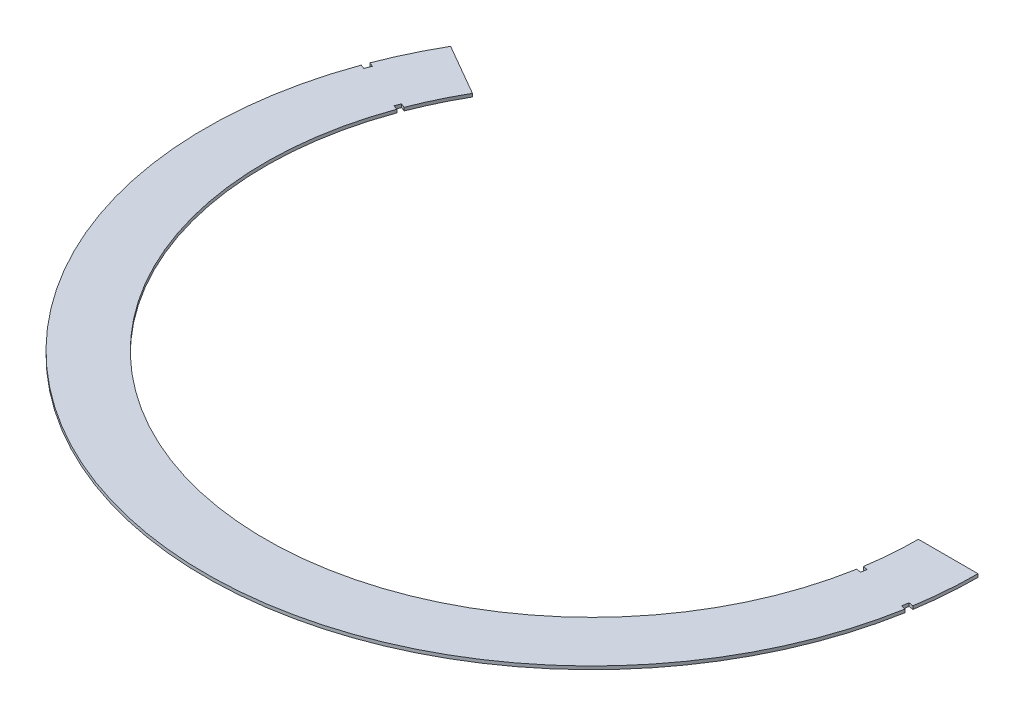
ISO-10303-21;
HEADER;
FILE_DESCRIPTION(('STEP AP214'),'2;1');
FILE_NAME('part.step','',(''),(''),'','','');
FILE_SCHEMA(('AUTOMOTIVE_DESIGN { 1 0 10303 214 1 1 1 1 }'));
ENDSEC;
DATA;
#1=APPLICATION_CONTEXT('core data for automotive mechanical design processes');
#2=APPLICATION_PROTOCOL_DEFINITION('international standard','automotive_design',2000,#1);
#3=PRODUCT_CONTEXT('',#1,'mechanical');
#4=PRODUCT('Part','Part','',(#3));
#5=PRODUCT_RELATED_PRODUCT_CATEGORY('part','',(#4));
#6=PRODUCT_DEFINITION_FORMATION('','',#4);
#7=PRODUCT_DEFINITION_CONTEXT('part definition',#1,'design');
#8=PRODUCT_DEFINITION('design','',#6,#7);
#9=PRODUCT_DEFINITION_SHAPE('','',#8);
#10=(LENGTH_UNIT() NAMED_UNIT(*) SI_UNIT(.MILLI.,.METRE.));
#11=(NAMED_UNIT(*) PLANE_ANGLE_UNIT() SI_UNIT($,.RADIAN.));
#12=(NAMED_UNIT(*) SI_UNIT($,.STERADIAN.) SOLID_ANGLE_UNIT());
#13=UNCERTAINTY_MEASURE_WITH_UNIT(LENGTH_MEASURE(1.E-05),#10,'distance_accuracy_value','');
#14=(GEOMETRIC_REPRESENTATION_CONTEXT(3) GLOBAL_UNCERTAINTY_ASSIGNED_CONTEXT((#13)) GLOBAL_UNIT_ASSIGNED_CONTEXT((#10,
#11,#12)) REPRESENTATION_CONTEXT('',''));
#15=CARTESIAN_POINT('',(0.,0.,0.));
#16=DIRECTION('',(0.,0.,1.));
#17=DIRECTION('',(1.,0.,0.));
#18=AXIS2_PLACEMENT_3D('',#15,#16,#17);
#19=CARTESIAN_POINT('',(0.,0.,0.));
#20=DIRECTION('',(0.,1.,0.));
#21=DIRECTION('',(0.,0.,1.));
#22=AXIS2_PLACEMENT_3D('',#19,#20,#21);
#23=PLANE('',#22);
#24=DIRECTION('',(0.98480775301221,0.,0.173648177666918));
#25=VECTOR('',#24,1.);
#26=CARTESIAN_POINT('',(0.,0.,0.));
#27=LINE('',#26,#25);
#28=CARTESIAN_POINT('',(81.9681853573279,0.,14.4532026382084));
#29=VERTEX_POINT('',#28);
#30=CARTESIAN_POINT('',(82.9405089586884,0.,14.6246495231078));
#31=VERTEX_POINT('',#30);
#32=EDGE_CURVE('E204',#29,#31,#27,.T.);
#33=ORIENTED_EDGE('',*,*,#32,.T.);
#34=CARTESIAN_POINT('',(0.,0.,0.));
#35=DIRECTION('',(0.,1.,0.));
#36=DIRECTION('',(0.,0.,1.));
#37=AXIS2_PLACEMENT_3D('',#34,#35,#36);
#38=CIRCLE('',#37,84.22);
#39=CARTESIAN_POINT('',(-79.140912522589,0.,-28.8049364708883));
#40=VERTEX_POINT('',#39);
#41=EDGE_CURVE('E374',#40,#31,#38,.T.);
#42=ORIENTED_EDGE('',*,*,#41,.F.);
#43=DIRECTION('',(-0.939692620785906,0.,-0.342020143325675));
#44=VECTOR('',#43,1.);
#45=CARTESIAN_POINT('',(0.,0.,0.));
#46=LINE('',#45,#44);
#47=CARTESIAN_POINT('',(-78.213132140662,0.,-28.4672520279307));
#48=VERTEX_POINT('',#47);
#49=EDGE_CURVE('E397',#48,#40,#46,.T.);
#50=ORIENTED_EDGE('',*,*,#49,.F.);
#51=DIRECTION('',(-0.358367949545303,0.,0.933580426497201));
#52=VECTOR('',#51,1.);
#53=CARTESIAN_POINT('',(-77.6925630930972,0.,-29.8233807611599));
#54=LINE('',#53,#52);
#55=CARTESIAN_POINT('',(-77.6925630930972,0.,-29.8233807611599));
#56=VERTEX_POINT('',#55);
#57=EDGE_CURVE('E598',#56,#48,#54,.T.);
#58=ORIENTED_EDGE('',*,*,#57,.F.);
#59=DIRECTION('',(-0.933580426497202,0.,-0.3583679495453));
#60=VECTOR('',#59,1.);
#61=CARTESIAN_POINT('',(-66.4895979751307,0.,-25.5229653666163));
#62=LINE('',#61,#60);
#63=CARTESIAN_POINT('',(-78.6261435195944,0.,-30.1817487107052));
#64=VERTEX_POINT('',#63);
#65=EDGE_CURVE('E266',#56,#64,#62,.T.);
#66=ORIENTED_EDGE('',*,*,#65,.T.);
#67=CARTESIAN_POINT('',(0.,0.,0.));
#68=DIRECTION('',(0.,1.,0.));
#69=DIRECTION('',(0.,0.,1.));
#70=AXIS2_PLACEMENT_3D('',#67,#68,#69);
#71=CIRCLE('',#70,84.22);
#72=CARTESIAN_POINT('',(-72.9366595067257,0.,-42.1099999999996));
#73=VERTEX_POINT('',#72);
#74=EDGE_CURVE('E262',#73,#64,#71,.T.);
#75=ORIENTED_EDGE('',*,*,#74,.F.);
#76=DIRECTION('',(-0.866025403784442,0.,-0.499999999999995));
#77=VECTOR('',#76,1.);
#78=CARTESIAN_POINT('',(-61.6783292575279,0.,-35.6099999999996));
#79=LINE('',#78,#77);
#80=CARTESIAN_POINT('',(-61.6783292575279,0.,-35.6099999999996));
#81=VERTEX_POINT('',#80);
#82=EDGE_CURVE('E281',#81,#73,#79,.T.);
#83=ORIENTED_EDGE('',*,*,#82,.F.);
#84=CARTESIAN_POINT('',(0.,0.,0.));
#85=DIRECTION('',(0.,-1.,0.));
#86=DIRECTION('',(0.,0.,-1.));
#87=AXIS2_PLACEMENT_3D('',#84,#85,#86);
#88=CIRCLE('',#87,71.22);
#89=CARTESIAN_POINT('',(-66.4895979751307,0.,-25.5229653666163));
#90=VERTEX_POINT('',#89);
#91=EDGE_CURVE('E257',#90,#81,#88,.T.);
#92=ORIENTED_EDGE('',*,*,#91,.F.);
#93=CARTESIAN_POINT('',(-67.4231784016279,0.,-25.8813333161616));
#94=VERTEX_POINT('',#93);
#95=EDGE_CURVE('E269',#90,#94,#62,.T.);
#96=ORIENTED_EDGE('',*,*,#95,.T.);
#97=DIRECTION('',(0.358367949545302,0.,-0.933580426497201));
#98=VECTOR('',#97,1.);
#99=CARTESIAN_POINT('',(-67.4231784016279,0.,-25.8813333161616));
#100=LINE('',#99,#98);
#101=CARTESIAN_POINT('',(-67.8749387550902,0.,-24.7044573594948));
#102=VERTEX_POINT('',#101);
#103=EDGE_CURVE('E591',#102,#94,#100,.T.);
#104=ORIENTED_EDGE('',*,*,#103,.F.);
#105=CARTESIAN_POINT('',(-66.9249084523723,0.,-24.3586746076545));
#106=VERTEX_POINT('',#105);
#107=EDGE_CURVE('E43',#106,#102,#46,.T.);
#108=ORIENTED_EDGE('',*,*,#107,.F.);
#109=CARTESIAN_POINT('',(0.,0.,0.));
#110=DIRECTION('',(0.,-1.,0.));
#111=DIRECTION('',(0.,0.,-1.));
#112=AXIS2_PLACEMENT_3D('',#109,#110,#111);
#113=CIRCLE('',#112,71.22);
#114=CARTESIAN_POINT('',(70.1380081695296,0.,12.3672232134379));
#115=VERTEX_POINT('',#114);
#116=EDGE_CURVE('E37',#115,#106,#113,.T.);
#117=ORIENTED_EDGE('',*,*,#116,.F.);
#118=DIRECTION('',(0.98480775301221,0.,0.173648177666918));
#119=VECTOR('',#118,1.);
#120=CARTESIAN_POINT('',(0.,0.,0.));
#121=LINE('',#120,#119);
#122=CARTESIAN_POINT('',(71.1336499219685,0.,12.5427817175127));
#123=VERTEX_POINT('',#122);
#124=EDGE_CURVE('E234',#115,#123,#121,.T.);
#125=ORIENTED_EDGE('',*,*,#124,.T.);
#126=DIRECTION('',(0.156434465040222,0.,-0.987688340595139));
#127=VECTOR('',#126,1.);
#128=CARTESIAN_POINT('',(71.3308519577809,0.,11.297697065205));
#129=LINE('',#128,#127);
#130=CARTESIAN_POINT('',(71.3308519577809,0.,11.297697065205));
#131=VERTEX_POINT('',#130);
#132=EDGE_CURVE('E214',#123,#131,#129,.T.);
#133=ORIENTED_EDGE('',*,*,#132,.T.);
#134=DIRECTION('',(0.987688340595139,0.,0.156434465040225));
#135=VECTOR('',#134,1.);
#136=CARTESIAN_POINT('',(70.3431636171858,0.,11.1412626001648));
#137=LINE('',#136,#135);
#138=CARTESIAN_POINT('',(70.3431636171858,0.,11.1412626001648));
#139=VERTEX_POINT('',#138);
#140=EDGE_CURVE('E224',#139,#131,#137,.T.);
#141=ORIENTED_EDGE('',*,*,#140,.F.);
#142=CARTESIAN_POINT('',(71.22,0.,0.));
#143=VERTEX_POINT('',#142);
#144=EDGE_CURVE('E378',#143,#139,#113,.T.);
#145=ORIENTED_EDGE('',*,*,#144,.F.);
#146=DIRECTION('',(-1.,0.,0.));
#147=VECTOR('',#146,1.);
#148=CARTESIAN_POINT('',(71.22,0.,0.));
#149=LINE('',#148,#147);
#150=CARTESIAN_POINT('',(84.22,0.,0.));
#151=VERTEX_POINT('',#150);
#152=EDGE_CURVE('E365',#151,#143,#149,.T.);
#153=ORIENTED_EDGE('',*,*,#152,.F.);
#154=CARTESIAN_POINT('',(83.1831120449226,0.,13.1749106456877));
#155=VERTEX_POINT('',#154);
#156=EDGE_CURVE('E413',#155,#151,#38,.T.);
#157=ORIENTED_EDGE('',*,*,#156,.F.);
#158=DIRECTION('',(0.987688340595139,0.,0.156434465040225));
#159=VECTOR('',#158,1.);
#160=CARTESIAN_POINT('',(70.3431636171858,0.,11.1412626001648));
#161=LINE('',#160,#159);
#162=CARTESIAN_POINT('',(82.1954237043275,0.,13.0184761806475));
#163=VERTEX_POINT('',#162);
#164=EDGE_CURVE('E51',#163,#155,#161,.T.);
#165=ORIENTED_EDGE('',*,*,#164,.F.);
#166=DIRECTION('',(-0.156434465040222,0.,0.987688340595139));
#167=VECTOR('',#166,1.);
#168=CARTESIAN_POINT('',(82.1954237043275,0.,13.0184761806475));
#169=LINE('',#168,#167);
#170=EDGE_CURVE('E180',#163,#29,#169,.T.);
#171=ORIENTED_EDGE('',*,*,#170,.T.);
#172=EDGE_LOOP('',(#33,#42,#50,#58,#66,#75,#83,#92,#96,#104,#108,#117,#125,#133,#141,#145,#153,
#157,#165,#171));
#173=FACE_BOUND('',#172,.T.);
#174=ADVANCED_FACE('F33',(#173),#23,.F.);
#175=CARTESIAN_POINT('',(0.,0.7,0.));
#176=DIRECTION('',(0.,1.,0.));
#177=DIRECTION('',(0.,0.,1.));
#178=AXIS2_PLACEMENT_3D('',#175,#176,#177);
#179=PLANE('',#178);
#180=CARTESIAN_POINT('',(0.,0.7,0.));
#181=DIRECTION('',(0.,1.,0.));
#182=DIRECTION('',(0.,0.,1.));
#183=AXIS2_PLACEMENT_3D('',#180,#181,#182);
#184=CIRCLE('',#183,84.22);
#185=CARTESIAN_POINT('',(-79.140912522589,0.7,-28.8049364708883));
#186=VERTEX_POINT('',#185);
#187=CARTESIAN_POINT('',(82.9405089586884,0.7,14.6246495231078));
#188=VERTEX_POINT('',#187);
#189=EDGE_CURVE('E385',#186,#188,#184,.T.);
#190=ORIENTED_EDGE('',*,*,#189,.T.);
#191=DIRECTION('',(-0.98480775301221,0.,-0.173648177666918));
#192=VECTOR('',#191,1.);
#193=CARTESIAN_POINT('',(84.9101244647128,0.7,14.9719458784417));
#194=LINE('',#193,#192);
#195=CARTESIAN_POINT('',(81.9681853573279,0.7,14.4532026382084));
#196=VERTEX_POINT('',#195);
#197=EDGE_CURVE('E192',#188,#196,#194,.T.);
#198=ORIENTED_EDGE('',*,*,#197,.T.);
#199=DIRECTION('',(-0.156434465040222,0.,0.987688340595139));
#200=VECTOR('',#199,1.);
#201=CARTESIAN_POINT('',(82.1954237043275,0.699999999999999,13.0184761806475));
#202=LINE('',#201,#200);
#203=CARTESIAN_POINT('',(82.1954237043275,0.699999999999999,13.0184761806475));
#204=VERTEX_POINT('',#203);
#205=EDGE_CURVE('E177',#204,#196,#202,.T.);
#206=ORIENTED_EDGE('',*,*,#205,.F.);
#207=DIRECTION('',(0.987688340595139,0.,0.156434465040225));
#208=VECTOR('',#207,1.);
#209=CARTESIAN_POINT('',(70.3431636171858,0.7,11.1412626001648));
#210=LINE('',#209,#208);
#211=CARTESIAN_POINT('',(83.1831120449226,0.7,13.1749106456877));
#212=VERTEX_POINT('',#211);
#213=EDGE_CURVE('E183',#204,#212,#210,.T.);
#214=ORIENTED_EDGE('',*,*,#213,.T.);
#215=CARTESIAN_POINT('',(84.22,0.7,0.));
#216=VERTEX_POINT('',#215);
#217=EDGE_CURVE('E383',#212,#216,#184,.T.);
#218=ORIENTED_EDGE('',*,*,#217,.T.);
#219=DIRECTION('',(-1.,0.,0.));
#220=VECTOR('',#219,1.);
#221=CARTESIAN_POINT('',(71.22,0.7,0.));
#222=LINE('',#221,#220);
#223=CARTESIAN_POINT('',(71.22,0.7,0.));
#224=VERTEX_POINT('',#223);
#225=EDGE_CURVE('E408',#216,#224,#222,.T.);
#226=ORIENTED_EDGE('',*,*,#225,.T.);
#227=CARTESIAN_POINT('',(0.,0.7,0.));
#228=DIRECTION('',(0.,-1.,0.));
#229=DIRECTION('',(0.,0.,-1.));
#230=AXIS2_PLACEMENT_3D('',#227,#228,#229);
#231=CIRCLE('',#230,71.22);
#232=CARTESIAN_POINT('',(70.3431636171858,0.7,11.1412626001648));
#233=VERTEX_POINT('',#232);
#234=EDGE_CURVE('E380',#224,#233,#231,.T.);
#235=ORIENTED_EDGE('',*,*,#234,.T.);
#236=DIRECTION('',(0.987688340595139,0.,0.156434465040225));
#237=VECTOR('',#236,1.);
#238=CARTESIAN_POINT('',(70.3431636171858,0.7,11.1412626001648));
#239=LINE('',#238,#237);
#240=CARTESIAN_POINT('',(71.3308519577809,0.699999999999999,11.297697065205));
#241=VERTEX_POINT('',#240);
#242=EDGE_CURVE('E59',#233,#241,#239,.T.);
#243=ORIENTED_EDGE('',*,*,#242,.T.);
#244=DIRECTION('',(0.156434465040222,0.,-0.987688340595139));
#245=VECTOR('',#244,1.);
#246=CARTESIAN_POINT('',(71.3308519577809,0.699999999999999,11.297697065205));
#247=LINE('',#246,#245);
#248=CARTESIAN_POINT('',(71.1336499219685,0.7,12.5427817175127));
#249=VERTEX_POINT('',#248);
#250=EDGE_CURVE('E221',#249,#241,#247,.T.);
#251=ORIENTED_EDGE('',*,*,#250,.F.);
#252=DIRECTION('',(-0.98480775301221,0.,-0.173648177666918));
#253=VECTOR('',#252,1.);
#254=CARTESIAN_POINT('',(84.9101244647128,0.7,14.9719458784417));
#255=LINE('',#254,#253);
#256=CARTESIAN_POINT('',(70.1380081695296,0.7,12.3672232134379));
#257=VERTEX_POINT('',#256);
#258=EDGE_CURVE('E239',#249,#257,#255,.T.);
#259=ORIENTED_EDGE('',*,*,#258,.T.);
#260=CARTESIAN_POINT('',(-66.9249084523722,0.7,-24.3586746076546));
#261=VERTEX_POINT('',#260);
#262=EDGE_CURVE('E407',#257,#261,#231,.T.);
#263=ORIENTED_EDGE('',*,*,#262,.T.);
#264=DIRECTION('',(0.939692620785906,0.,0.342020143325674));
#265=VECTOR('',#264,1.);
#266=CARTESIAN_POINT('',(-81.0202977641608,0.7,-29.4889767575397));
#267=LINE('',#266,#265);
#268=CARTESIAN_POINT('',(-67.8749387550902,0.7,-24.7044573594948));
#269=VERTEX_POINT('',#268);
#270=EDGE_CURVE('E405',#269,#261,#267,.T.);
#271=ORIENTED_EDGE('',*,*,#270,.F.);
#272=DIRECTION('',(0.358367949545302,0.,-0.933580426497201));
#273=VECTOR('',#272,1.);
#274=CARTESIAN_POINT('',(-67.4231784016279,0.699999999999999,-25.8813333161616));
#275=LINE('',#274,#273);
#276=CARTESIAN_POINT('',(-67.4231784016279,0.699999999999999,-25.8813333161616));
#277=VERTEX_POINT('',#276);
#278=EDGE_CURVE('E603',#269,#277,#275,.T.);
#279=ORIENTED_EDGE('',*,*,#278,.T.);
#280=DIRECTION('',(-0.933580426497202,0.,-0.3583679495453));
#281=VECTOR('',#280,1.);
#282=CARTESIAN_POINT('',(-66.4895979751307,0.7,-25.5229653666163));
#283=LINE('',#282,#281);
#284=CARTESIAN_POINT('',(-66.4895979751307,0.7,-25.5229653666163));
#285=VERTEX_POINT('',#284);
#286=EDGE_CURVE('E287',#285,#277,#283,.T.);
#287=ORIENTED_EDGE('',*,*,#286,.F.);
#288=CARTESIAN_POINT('',(0.,0.7,0.));
#289=DIRECTION('',(0.,-1.,0.));
#290=DIRECTION('',(0.,0.,-1.));
#291=AXIS2_PLACEMENT_3D('',#288,#289,#290);
#292=CIRCLE('',#291,71.22);
#293=CARTESIAN_POINT('',(-61.6783292575279,0.7,-35.6099999999996));
#294=VERTEX_POINT('',#293);
#295=EDGE_CURVE('E252',#285,#294,#292,.T.);
#296=ORIENTED_EDGE('',*,*,#295,.T.);
#297=DIRECTION('',(-0.866025403784442,0.,-0.499999999999995));
#298=VECTOR('',#297,1.);
#299=CARTESIAN_POINT('',(-61.6783292575279,0.7,-35.6099999999996));
#300=LINE('',#299,#298);
#301=CARTESIAN_POINT('',(-72.9366595067257,0.7,-42.1099999999996));
#302=VERTEX_POINT('',#301);
#303=EDGE_CURVE('E255',#294,#302,#300,.T.);
#304=ORIENTED_EDGE('',*,*,#303,.T.);
#305=CARTESIAN_POINT('',(0.,0.7,0.));
#306=DIRECTION('',(0.,1.,0.));
#307=DIRECTION('',(0.,0.,1.));
#308=AXIS2_PLACEMENT_3D('',#305,#306,#307);
#309=CIRCLE('',#308,84.22);
#310=CARTESIAN_POINT('',(-78.6261435195944,0.7,-30.1817487107052));
#311=VERTEX_POINT('',#310);
#312=EDGE_CURVE('E256',#302,#311,#309,.T.);
#313=ORIENTED_EDGE('',*,*,#312,.T.);
#314=CARTESIAN_POINT('',(-77.6925630930972,0.699999999999999,-29.8233807611599));
#315=VERTEX_POINT('',#314);
#316=EDGE_CURVE('E270',#315,#311,#283,.T.);
#317=ORIENTED_EDGE('',*,*,#316,.F.);
#318=DIRECTION('',(-0.358367949545303,0.,0.933580426497201));
#319=VECTOR('',#318,1.);
#320=CARTESIAN_POINT('',(-77.6925630930972,0.699999999999999,-29.8233807611599));
#321=LINE('',#320,#319);
#322=CARTESIAN_POINT('',(-78.213132140662,0.7,-28.4672520279307));
#323=VERTEX_POINT('',#322);
#324=EDGE_CURVE('E596',#315,#323,#321,.T.);
#325=ORIENTED_EDGE('',*,*,#324,.T.);
#326=EDGE_CURVE('E421',#186,#323,#267,.T.);
#327=ORIENTED_EDGE('',*,*,#326,.F.);
#328=EDGE_LOOP('',(#190,#198,#206,#214,#218,#226,#235,#243,#251,#259,#263,#271,#279,#287,#296,
#304,#313,#317,#325,#327));
#329=FACE_BOUND('',#328,.T.);
#330=ADVANCED_FACE('F191',(#329),#179,.T.);
#331=CARTESIAN_POINT('',(0.,0.7,0.));
#332=DIRECTION('',(0.,-1.,0.));
#333=DIRECTION('',(0.,0.,-1.));
#334=AXIS2_PLACEMENT_3D('',#331,#332,#333);
#335=CYLINDRICAL_SURFACE('',#334,84.22);
#336=DIRECTION('',(0.,-1.,0.));
#337=VECTOR('',#336,1.);
#338=CARTESIAN_POINT('',(82.9405089586884,0.7,14.6246495231078));
#339=LINE('',#338,#337);
#340=EDGE_CURVE('E209',#31,#188,#339,.F.);
#341=ORIENTED_EDGE('',*,*,#340,.T.);
#342=ORIENTED_EDGE('',*,*,#189,.F.);
#343=DIRECTION('',(0.,-1.,0.));
#344=VECTOR('',#343,1.);
#345=CARTESIAN_POINT('',(-79.140912522589,0.7,-28.8049364708883));
#346=LINE('',#345,#344);
#347=EDGE_CURVE('E416',#40,#186,#346,.F.);
#348=ORIENTED_EDGE('',*,*,#347,.F.);
#349=ORIENTED_EDGE('',*,*,#41,.T.);
#350=EDGE_LOOP('',(#341,#342,#348,#349));
#351=FACE_BOUND('',#350,.T.);
#352=ADVANCED_FACE('F35',(#351),#335,.T.);
#353=DIRECTION('',(0.,-1.,0.));
#354=VECTOR('',#353,1.);
#355=CARTESIAN_POINT('',(83.1831120449226,0.7,13.1749106456877));
#356=LINE('',#355,#354);
#357=EDGE_CURVE('E185',#212,#155,#356,.T.);
#358=ORIENTED_EDGE('',*,*,#357,.T.);
#359=ORIENTED_EDGE('',*,*,#156,.T.);
#360=DIRECTION('',(0.,-1.,0.));
#361=VECTOR('',#360,1.);
#362=CARTESIAN_POINT('',(84.22,0.7,0.));
#363=LINE('',#362,#361);
#364=EDGE_CURVE('E371',#216,#151,#363,.T.);
#365=ORIENTED_EDGE('',*,*,#364,.F.);
#366=ORIENTED_EDGE('',*,*,#217,.F.);
#367=EDGE_LOOP('',(#358,#359,#365,#366));
#368=FACE_BOUND('',#367,.T.);
#369=ADVANCED_FACE('F346',(#368),#335,.T.);
#370=CARTESIAN_POINT('',(0.,0.7,0.));
#371=DIRECTION('',(0.,-1.,0.));
#372=DIRECTION('',(0.,0.,-1.));
#373=AXIS2_PLACEMENT_3D('',#370,#371,#372);
#374=CYLINDRICAL_SURFACE('',#373,71.22);
#375=DIRECTION('',(0.,-1.,0.));
#376=VECTOR('',#375,1.);
#377=CARTESIAN_POINT('',(70.1380081695296,0.7,12.3672232134379));
#378=LINE('',#377,#376);
#379=EDGE_CURVE('E244',#257,#115,#378,.T.);
#380=ORIENTED_EDGE('',*,*,#379,.T.);
#381=ORIENTED_EDGE('',*,*,#116,.T.);
#382=DIRECTION('',(0.,-1.,0.));
#383=VECTOR('',#382,1.);
#384=CARTESIAN_POINT('',(-66.9249084523722,0.7,-24.3586746076546));
#385=LINE('',#384,#383);
#386=EDGE_CURVE('E418',#261,#106,#385,.T.);
#387=ORIENTED_EDGE('',*,*,#386,.F.);
#388=ORIENTED_EDGE('',*,*,#262,.F.);
#389=EDGE_LOOP('',(#380,#381,#387,#388));
#390=FACE_BOUND('',#389,.T.);
#391=ADVANCED_FACE('F343',(#390),#374,.F.);
#392=DIRECTION('',(0.,-1.,0.));
#393=VECTOR('',#392,1.);
#394=CARTESIAN_POINT('',(70.3431636171858,0.7,11.1412626001648));
#395=LINE('',#394,#393);
#396=EDGE_CURVE('E227',#233,#139,#395,.T.);
#397=ORIENTED_EDGE('',*,*,#396,.F.);
#398=ORIENTED_EDGE('',*,*,#234,.F.);
#399=DIRECTION('',(0.,-1.,0.));
#400=VECTOR('',#399,1.);
#401=CARTESIAN_POINT('',(71.22,0.7,0.));
#402=LINE('',#401,#400);
#403=EDGE_CURVE('E368',#224,#143,#402,.T.);
#404=ORIENTED_EDGE('',*,*,#403,.T.);
#405=ORIENTED_EDGE('',*,*,#144,.T.);
#406=EDGE_LOOP('',(#397,#398,#404,#405));
#407=FACE_BOUND('',#406,.T.);
#408=ADVANCED_FACE('F345',(#407),#374,.F.);
#409=CARTESIAN_POINT('',(-81.0202977641608,0.7,-29.4889767575397));
#410=DIRECTION('',(0.342020143325675,0.,-0.939692620785906));
#411=DIRECTION('',(-0.939692620785906,0.,-0.342020143325675));
#412=AXIS2_PLACEMENT_3D('',#409,#410,#411);
#413=PLANE('',#412);
#414=ORIENTED_EDGE('',*,*,#326,.T.);
#415=DIRECTION('',(0.,-1.,0.));
#416=VECTOR('',#415,1.);
#417=CARTESIAN_POINT('',(-78.213132140662,12.7205562477796,-28.4672520279307));
#418=LINE('',#417,#416);
#419=EDGE_CURVE('E595',#323,#48,#418,.T.);
#420=ORIENTED_EDGE('',*,*,#419,.T.);
#421=ORIENTED_EDGE('',*,*,#49,.T.);
#422=ORIENTED_EDGE('',*,*,#347,.T.);
#423=EDGE_LOOP('',(#414,#420,#421,#422));
#424=FACE_BOUND('',#423,.T.);
#425=ADVANCED_FACE('F360',(#424),#413,.T.);
#426=ORIENTED_EDGE('',*,*,#107,.T.);
#427=DIRECTION('',(0.,1.,0.));
#428=VECTOR('',#427,1.);
#429=CARTESIAN_POINT('',(-67.8749387550902,0.7,-24.7044573594948));
#430=LINE('',#429,#428);
#431=EDGE_CURVE('E11',#102,#269,#430,.T.);
#432=ORIENTED_EDGE('',*,*,#431,.T.);
#433=ORIENTED_EDGE('',*,*,#270,.T.);
#434=ORIENTED_EDGE('',*,*,#386,.T.);
#435=EDGE_LOOP('',(#426,#432,#433,#434));
#436=FACE_BOUND('',#435,.T.);
#437=ADVANCED_FACE('F351',(#436),#413,.T.);
#438=CARTESIAN_POINT('',(71.22,0.7,0.));
#439=DIRECTION('',(0.,0.,1.));
#440=DIRECTION('',(1.,0.,0.));
#441=AXIS2_PLACEMENT_3D('',#438,#439,#440);
#442=PLANE('',#441);
#443=ORIENTED_EDGE('',*,*,#152,.T.);
#444=ORIENTED_EDGE('',*,*,#403,.F.);
#445=ORIENTED_EDGE('',*,*,#225,.F.);
#446=ORIENTED_EDGE('',*,*,#364,.T.);
#447=EDGE_LOOP('',(#443,#444,#445,#446));
#448=FACE_BOUND('',#447,.T.);
#449=ADVANCED_FACE('F348',(#448),#442,.F.);
#450=CARTESIAN_POINT('',(-77.6925630930972,12.7205562477796,-29.8233807611599));
#451=DIRECTION('',(0.933580426497201,0.,0.358367949545303));
#452=DIRECTION('',(0.358367949545303,0.,-0.933580426497201));
#453=AXIS2_PLACEMENT_3D('',#450,#451,#452);
#454=PLANE('',#453);
#455=ORIENTED_EDGE('',*,*,#324,.F.);
#456=DIRECTION('',(0.,-1.,0.));
#457=VECTOR('',#456,1.);
#458=CARTESIAN_POINT('',(-77.6925630930972,12.7205562477796,-29.8233807611599));
#459=LINE('',#458,#457);
#460=EDGE_CURVE('E290',#315,#56,#459,.T.);
#461=ORIENTED_EDGE('',*,*,#460,.T.);
#462=ORIENTED_EDGE('',*,*,#57,.T.);
#463=ORIENTED_EDGE('',*,*,#419,.F.);
#464=EDGE_LOOP('',(#455,#461,#462,#463));
#465=FACE_BOUND('',#464,.T.);
#466=ADVANCED_FACE('F350',(#465),#454,.F.);
#467=CARTESIAN_POINT('',(-67.4231784016279,12.7205562477796,-25.8813333161616));
#468=DIRECTION('',(-0.933580426497201,0.,-0.358367949545302));
#469=DIRECTION('',(-0.358367949545302,0.,0.933580426497201));
#470=AXIS2_PLACEMENT_3D('',#467,#468,#469);
#471=PLANE('',#470);
#472=ORIENTED_EDGE('',*,*,#431,.F.);
#473=ORIENTED_EDGE('',*,*,#103,.T.);
#474=DIRECTION('',(0.,-1.,0.));
#475=VECTOR('',#474,1.);
#476=CARTESIAN_POINT('',(-67.4231784016279,12.7205562477796,-25.8813333161616));
#477=LINE('',#476,#475);
#478=EDGE_CURVE('E594',#277,#94,#477,.T.);
#479=ORIENTED_EDGE('',*,*,#478,.F.);
#480=ORIENTED_EDGE('',*,*,#278,.F.);
#481=EDGE_LOOP('',(#472,#473,#479,#480));
#482=FACE_BOUND('',#481,.T.);
#483=ADVANCED_FACE('F357',(#482),#471,.F.);
#484=CARTESIAN_POINT('',(-66.4895979751307,0.7,-25.5229653666163));
#485=DIRECTION('',(-0.3583679495453,0.,0.933580426497202));
#486=DIRECTION('',(0.933580426497202,0.,0.3583679495453));
#487=AXIS2_PLACEMENT_3D('',#484,#485,#486);
#488=PLANE('',#487);
#489=ORIENTED_EDGE('',*,*,#460,.F.);
#490=ORIENTED_EDGE('',*,*,#316,.T.);
#491=DIRECTION('',(0.,-1.,0.));
#492=VECTOR('',#491,1.);
#493=CARTESIAN_POINT('',(-78.6261435195944,0.7,-30.1817487107052));
#494=LINE('',#493,#492);
#495=EDGE_CURVE('E275',#311,#64,#494,.T.);
#496=ORIENTED_EDGE('',*,*,#495,.T.);
#497=ORIENTED_EDGE('',*,*,#65,.F.);
#498=EDGE_LOOP('',(#489,#490,#496,#497));
#499=FACE_BOUND('',#498,.T.);
#500=ADVANCED_FACE('F307',(#499),#488,.T.);
#501=ORIENTED_EDGE('',*,*,#478,.T.);
#502=ORIENTED_EDGE('',*,*,#95,.F.);
#503=DIRECTION('',(0.,-1.,0.));
#504=VECTOR('',#503,1.);
#505=CARTESIAN_POINT('',(-66.4895979751307,0.7,-25.5229653666163));
#506=LINE('',#505,#504);
#507=EDGE_CURVE('E282',#285,#90,#506,.T.);
#508=ORIENTED_EDGE('',*,*,#507,.F.);
#509=ORIENTED_EDGE('',*,*,#286,.T.);
#510=EDGE_LOOP('',(#501,#502,#508,#509));
#511=FACE_BOUND('',#510,.T.);
#512=ADVANCED_FACE('F483',(#511),#488,.T.);
#513=CARTESIAN_POINT('',(0.,0.7,0.));
#514=DIRECTION('',(0.,-1.,0.));
#515=DIRECTION('',(0.,0.,-1.));
#516=AXIS2_PLACEMENT_3D('',#513,#514,#515);
#517=CYLINDRICAL_SURFACE('',#516,84.22);
#518=ORIENTED_EDGE('',*,*,#495,.F.);
#519=ORIENTED_EDGE('',*,*,#312,.F.);
#520=DIRECTION('',(0.,-1.,0.));
#521=VECTOR('',#520,1.);
#522=CARTESIAN_POINT('',(-72.9366595067257,0.7,-42.1099999999996));
#523=LINE('',#522,#521);
#524=EDGE_CURVE('E249',#302,#73,#523,.T.);
#525=ORIENTED_EDGE('',*,*,#524,.T.);
#526=ORIENTED_EDGE('',*,*,#74,.T.);
#527=EDGE_LOOP('',(#518,#519,#525,#526));
#528=FACE_BOUND('',#527,.T.);
#529=ADVANCED_FACE('F313',(#528),#517,.T.);
#530=CARTESIAN_POINT('',(0.,0.7,0.));
#531=DIRECTION('',(0.,-1.,0.));
#532=DIRECTION('',(0.,0.,-1.));
#533=AXIS2_PLACEMENT_3D('',#530,#531,#532);
#534=CYLINDRICAL_SURFACE('',#533,71.22);
#535=ORIENTED_EDGE('',*,*,#507,.T.);
#536=ORIENTED_EDGE('',*,*,#91,.T.);
#537=DIRECTION('',(0.,-1.,0.));
#538=VECTOR('',#537,1.);
#539=CARTESIAN_POINT('',(-61.6783292575279,0.7,-35.6099999999996));
#540=LINE('',#539,#538);
#541=EDGE_CURVE('E293',#294,#81,#540,.T.);
#542=ORIENTED_EDGE('',*,*,#541,.F.);
#543=ORIENTED_EDGE('',*,*,#295,.F.);
#544=EDGE_LOOP('',(#535,#536,#542,#543));
#545=FACE_BOUND('',#544,.T.);
#546=ADVANCED_FACE('F318',(#545),#534,.F.);
#547=CARTESIAN_POINT('',(-61.6783292575279,0.7,-35.6099999999996));
#548=DIRECTION('',(-0.499999999999995,0.,0.866025403784442));
#549=DIRECTION('',(0.866025403784442,0.,0.499999999999995));
#550=AXIS2_PLACEMENT_3D('',#547,#548,#549);
#551=PLANE('',#550);
#552=ORIENTED_EDGE('',*,*,#82,.T.);
#553=ORIENTED_EDGE('',*,*,#524,.F.);
#554=ORIENTED_EDGE('',*,*,#303,.F.);
#555=ORIENTED_EDGE('',*,*,#541,.T.);
#556=EDGE_LOOP('',(#552,#553,#554,#555));
#557=FACE_BOUND('',#556,.T.);
#558=ADVANCED_FACE('F322',(#557),#551,.F.);
#559=CARTESIAN_POINT('',(84.9101244647128,0.7,14.9719458784417));
#560=DIRECTION('',(0.173648177666918,0.,-0.98480775301221));
#561=DIRECTION('',(0.98480775301221,0.,0.173648177666918));
#562=AXIS2_PLACEMENT_3D('',#559,#560,#561);
#563=PLANE('',#562);
#564=ORIENTED_EDGE('',*,*,#124,.F.);
#565=ORIENTED_EDGE('',*,*,#379,.F.);
#566=ORIENTED_EDGE('',*,*,#258,.F.);
#567=DIRECTION('',(0.,1.,0.));
#568=VECTOR('',#567,1.);
#569=CARTESIAN_POINT('',(71.1336499219685,0.7,12.5427817175127));
#570=LINE('',#569,#568);
#571=EDGE_CURVE('E217',#123,#249,#570,.T.);
#572=ORIENTED_EDGE('',*,*,#571,.F.);
#573=EDGE_LOOP('',(#564,#565,#566,#572));
#574=FACE_BOUND('',#573,.T.);
#575=ADVANCED_FACE('F324',(#574),#563,.T.);
#576=CARTESIAN_POINT('',(70.3431636171858,0.7,11.1412626001648));
#577=DIRECTION('',(-0.156434465040225,0.,0.987688340595139));
#578=DIRECTION('',(-0.987688340595139,0.,-0.156434465040225));
#579=AXIS2_PLACEMENT_3D('',#576,#577,#578);
#580=PLANE('',#579);
#581=DIRECTION('',(0.,-1.,0.));
#582=VECTOR('',#581,1.);
#583=CARTESIAN_POINT('',(71.3308519577809,12.7205562477796,11.297697065205));
#584=LINE('',#583,#582);
#585=EDGE_CURVE('E219',#241,#131,#584,.T.);
#586=ORIENTED_EDGE('',*,*,#585,.F.);
#587=ORIENTED_EDGE('',*,*,#242,.F.);
#588=ORIENTED_EDGE('',*,*,#396,.T.);
#589=ORIENTED_EDGE('',*,*,#140,.T.);
#590=EDGE_LOOP('',(#586,#587,#588,#589));
#591=FACE_BOUND('',#590,.T.);
#592=ADVANCED_FACE('F330',(#591),#580,.T.);
#593=CARTESIAN_POINT('',(71.3308519577809,12.7205562477796,11.297697065205));
#594=DIRECTION('',(0.987688340595139,0.,0.156434465040222));
#595=DIRECTION('',(-0.156434465040222,0.,0.987688340595139));
#596=AXIS2_PLACEMENT_3D('',#593,#594,#595);
#597=PLANE('',#596);
#598=ORIENTED_EDGE('',*,*,#571,.T.);
#599=ORIENTED_EDGE('',*,*,#250,.T.);
#600=ORIENTED_EDGE('',*,*,#585,.T.);
#601=ORIENTED_EDGE('',*,*,#132,.F.);
#602=EDGE_LOOP('',(#598,#599,#600,#601));
#603=FACE_BOUND('',#602,.T.);
#604=ADVANCED_FACE('F547',(#603),#597,.F.);
#605=CARTESIAN_POINT('',(84.9101244647128,0.7,14.9719458784417));
#606=DIRECTION('',(0.173648177666918,0.,-0.98480775301221));
#607=DIRECTION('',(0.98480775301221,0.,0.173648177666918));
#608=AXIS2_PLACEMENT_3D('',#605,#606,#607);
#609=PLANE('',#608);
#610=ORIENTED_EDGE('',*,*,#197,.F.);
#611=ORIENTED_EDGE('',*,*,#340,.F.);
#612=ORIENTED_EDGE('',*,*,#32,.F.);
#613=DIRECTION('',(0.,-1.,0.));
#614=VECTOR('',#613,1.);
#615=CARTESIAN_POINT('',(81.9681853573279,12.7205562477796,14.4532026382084));
#616=LINE('',#615,#614);
#617=EDGE_CURVE('E188',#196,#29,#616,.T.);
#618=ORIENTED_EDGE('',*,*,#617,.F.);
#619=EDGE_LOOP('',(#610,#611,#612,#618));
#620=FACE_BOUND('',#619,.T.);
#621=ADVANCED_FACE('F431',(#620),#609,.T.);
#622=CARTESIAN_POINT('',(70.3431636171858,0.7,11.1412626001648));
#623=DIRECTION('',(-0.156434465040225,0.,0.987688340595139));
#624=DIRECTION('',(-0.987688340595139,0.,-0.156434465040225));
#625=AXIS2_PLACEMENT_3D('',#622,#623,#624);
#626=PLANE('',#625);
#627=DIRECTION('',(0.,-1.,0.));
#628=VECTOR('',#627,1.);
#629=CARTESIAN_POINT('',(82.1954237043275,12.7205562477796,13.0184761806475));
#630=LINE('',#629,#628);
#631=EDGE_CURVE('E173',#204,#163,#630,.T.);
#632=ORIENTED_EDGE('',*,*,#631,.T.);
#633=ORIENTED_EDGE('',*,*,#164,.T.);
#634=ORIENTED_EDGE('',*,*,#357,.F.);
#635=ORIENTED_EDGE('',*,*,#213,.F.);
#636=EDGE_LOOP('',(#632,#633,#634,#635));
#637=FACE_BOUND('',#636,.T.);
#638=ADVANCED_FACE('F184',(#637),#626,.T.);
#639=CARTESIAN_POINT('',(82.1954237043275,12.7205562477796,13.0184761806475));
#640=DIRECTION('',(-0.987688340595139,0.,-0.156434465040222));
#641=DIRECTION('',(0.156434465040222,0.,-0.987688340595139));
#642=AXIS2_PLACEMENT_3D('',#639,#640,#641);
#643=PLANE('',#642);
#644=ORIENTED_EDGE('',*,*,#205,.T.);
#645=ORIENTED_EDGE('',*,*,#617,.T.);
#646=ORIENTED_EDGE('',*,*,#170,.F.);
#647=ORIENTED_EDGE('',*,*,#631,.F.);
#648=EDGE_LOOP('',(#644,#645,#646,#647));
#649=FACE_BOUND('',#648,.T.);
#650=ADVANCED_FACE('F175',(#649),#643,.F.);
#651=CLOSED_SHELL('',(#174,#330,#352,#369,#391,#408,#425,#437,#449,#466,#483,#500,#512,#529,
#546,#558,#575,#592,#604,#621,#638,#650));
#652=MANIFOLD_SOLID_BREP('B2',#651);
#653=ADVANCED_BREP_SHAPE_REPRESENTATION('',(#18,#652),#14);
#654=SHAPE_DEFINITION_REPRESENTATION(#9,#653);
ENDSEC;
END-ISO-10303-21;
